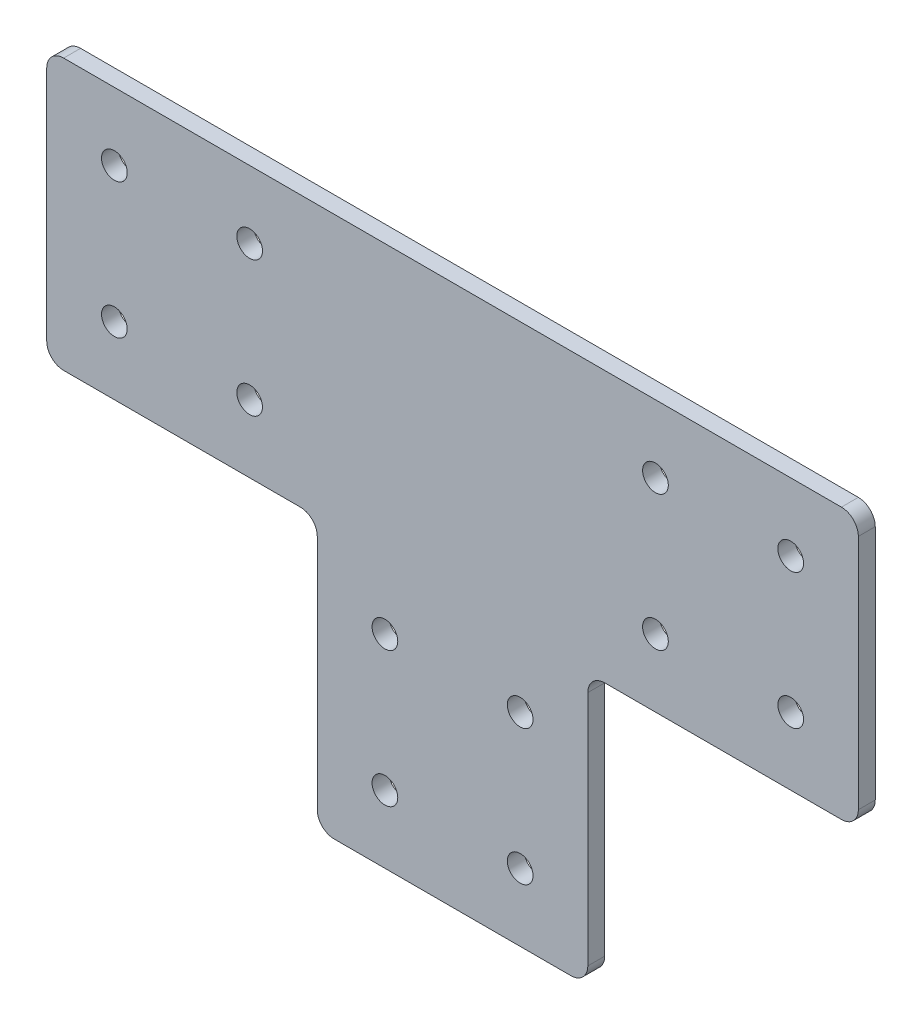
ISO-10303-21;
HEADER;
FILE_DESCRIPTION(('STEP AP214'),'2;1');
FILE_NAME('part.step','',(''),(''),'','','');
FILE_SCHEMA(('AUTOMOTIVE_DESIGN { 1 0 10303 214 1 1 1 1 }'));
ENDSEC;
DATA;
#1=APPLICATION_CONTEXT('core data for automotive mechanical design processes');
#2=APPLICATION_PROTOCOL_DEFINITION('international standard','automotive_design',2000,#1);
#3=PRODUCT_CONTEXT('',#1,'mechanical');
#4=PRODUCT('Part','Part','',(#3));
#5=PRODUCT_RELATED_PRODUCT_CATEGORY('part','',(#4));
#6=PRODUCT_DEFINITION_FORMATION('','',#4);
#7=PRODUCT_DEFINITION_CONTEXT('part definition',#1,'design');
#8=PRODUCT_DEFINITION('design','',#6,#7);
#9=PRODUCT_DEFINITION_SHAPE('','',#8);
#10=(LENGTH_UNIT() NAMED_UNIT(*) SI_UNIT(.MILLI.,.METRE.));
#11=(NAMED_UNIT(*) PLANE_ANGLE_UNIT() SI_UNIT($,.RADIAN.));
#12=(NAMED_UNIT(*) SI_UNIT($,.STERADIAN.) SOLID_ANGLE_UNIT());
#13=UNCERTAINTY_MEASURE_WITH_UNIT(LENGTH_MEASURE(1.E-05),#10,'distance_accuracy_value','');
#14=(GEOMETRIC_REPRESENTATION_CONTEXT(3) GLOBAL_UNCERTAINTY_ASSIGNED_CONTEXT((#13)) GLOBAL_UNIT_ASSIGNED_CONTEXT((#10,
#11,#12)) REPRESENTATION_CONTEXT('',''));
#15=CARTESIAN_POINT('',(0.,0.,0.));
#16=DIRECTION('',(0.,0.,1.));
#17=DIRECTION('',(1.,0.,0.));
#18=AXIS2_PLACEMENT_3D('',#15,#16,#17);
#19=CARTESIAN_POINT('',(0.,0.,3.175));
#20=DIRECTION('',(0.,0.,-1.));
#21=DIRECTION('',(-1.,0.,0.));
#22=AXIS2_PLACEMENT_3D('',#19,#20,#21);
#23=PLANE('',#22);
#24=DIRECTION('',(1.,0.,0.));
#25=VECTOR('',#24,1.);
#26=CARTESIAN_POINT('',(25.4,-101.6,3.175));
#27=LINE('',#26,#25);
#28=CARTESIAN_POINT('',(-22.225,-101.6,3.175));
#29=VERTEX_POINT('',#28);
#30=CARTESIAN_POINT('',(22.225,-101.6,3.175));
#31=VERTEX_POINT('',#30);
#32=EDGE_CURVE('E196',#29,#31,#27,.T.);
#33=ORIENTED_EDGE('',*,*,#32,.T.);
#34=CARTESIAN_POINT('',(22.225,-98.425,3.175));
#35=DIRECTION('',(0.,0.,-1.));
#36=DIRECTION('',(-1.,0.,0.));
#37=AXIS2_PLACEMENT_3D('',#34,#35,#36);
#38=CIRCLE('',#37,3.175);
#39=CARTESIAN_POINT('',(25.4,-98.425,3.175));
#40=VERTEX_POINT('',#39);
#41=EDGE_CURVE('E255',#31,#40,#38,.F.);
#42=ORIENTED_EDGE('',*,*,#41,.T.);
#43=DIRECTION('',(0.,1.,0.));
#44=VECTOR('',#43,1.);
#45=CARTESIAN_POINT('',(25.4,-50.8,3.175));
#46=LINE('',#45,#44);
#47=CARTESIAN_POINT('',(25.4,-53.975,3.175));
#48=VERTEX_POINT('',#47);
#49=EDGE_CURVE('E175',#40,#48,#46,.T.);
#50=ORIENTED_EDGE('',*,*,#49,.T.);
#51=CARTESIAN_POINT('',(28.575,-53.975,3.175));
#52=DIRECTION('',(0.,0.,-1.));
#53=DIRECTION('',(-1.,0.,0.));
#54=AXIS2_PLACEMENT_3D('',#51,#52,#53);
#55=CIRCLE('',#54,3.175);
#56=CARTESIAN_POINT('',(28.575,-50.8,3.175));
#57=VERTEX_POINT('',#56);
#58=EDGE_CURVE('E11',#48,#57,#55,.T.);
#59=ORIENTED_EDGE('',*,*,#58,.T.);
#60=DIRECTION('',(1.,0.,0.));
#61=VECTOR('',#60,1.);
#62=CARTESIAN_POINT('',(76.2,-50.8,3.175));
#63=LINE('',#62,#61);
#64=CARTESIAN_POINT('',(73.025,-50.8,3.175));
#65=VERTEX_POINT('',#64);
#66=EDGE_CURVE('E323',#57,#65,#63,.T.);
#67=ORIENTED_EDGE('',*,*,#66,.T.);
#68=CARTESIAN_POINT('',(73.025,-47.625,3.175));
#69=DIRECTION('',(0.,0.,-1.));
#70=DIRECTION('',(-1.,0.,0.));
#71=AXIS2_PLACEMENT_3D('',#68,#69,#70);
#72=CIRCLE('',#71,3.175);
#73=CARTESIAN_POINT('',(76.2,-47.625,3.175));
#74=VERTEX_POINT('',#73);
#75=EDGE_CURVE('E243',#65,#74,#72,.F.);
#76=ORIENTED_EDGE('',*,*,#75,.T.);
#77=DIRECTION('',(0.,1.,0.));
#78=VECTOR('',#77,1.);
#79=CARTESIAN_POINT('',(76.2,0.,3.175));
#80=LINE('',#79,#78);
#81=CARTESIAN_POINT('',(76.2,-3.175,3.175));
#82=VERTEX_POINT('',#81);
#83=EDGE_CURVE('E319',#74,#82,#80,.T.);
#84=ORIENTED_EDGE('',*,*,#83,.T.);
#85=CARTESIAN_POINT('',(73.025,-3.175,3.175));
#86=DIRECTION('',(0.,0.,-1.));
#87=DIRECTION('',(-1.,0.,0.));
#88=AXIS2_PLACEMENT_3D('',#85,#86,#87);
#89=CIRCLE('',#88,3.175);
#90=CARTESIAN_POINT('',(73.025,0.,3.175));
#91=VERTEX_POINT('',#90);
#92=EDGE_CURVE('E246',#82,#91,#89,.F.);
#93=ORIENTED_EDGE('',*,*,#92,.T.);
#94=DIRECTION('',(-1.,0.,0.));
#95=VECTOR('',#94,1.);
#96=CARTESIAN_POINT('',(-76.2,0.,3.175));
#97=LINE('',#96,#95);
#98=CARTESIAN_POINT('',(-73.025,0.,3.175));
#99=VERTEX_POINT('',#98);
#100=EDGE_CURVE('E315',#91,#99,#97,.T.);
#101=ORIENTED_EDGE('',*,*,#100,.T.);
#102=CARTESIAN_POINT('',(-73.025,-3.175,3.175));
#103=DIRECTION('',(0.,0.,-1.));
#104=DIRECTION('',(-1.,0.,0.));
#105=AXIS2_PLACEMENT_3D('',#102,#103,#104);
#106=CIRCLE('',#105,3.175);
#107=CARTESIAN_POINT('',(-76.2,-3.175,3.175));
#108=VERTEX_POINT('',#107);
#109=EDGE_CURVE('E240',#99,#108,#106,.F.);
#110=ORIENTED_EDGE('',*,*,#109,.T.);
#111=DIRECTION('',(0.,-1.,0.));
#112=VECTOR('',#111,1.);
#113=CARTESIAN_POINT('',(-76.2,-50.8,3.175));
#114=LINE('',#113,#112);
#115=CARTESIAN_POINT('',(-76.2,-47.625,3.175));
#116=VERTEX_POINT('',#115);
#117=EDGE_CURVE('E311',#108,#116,#114,.T.);
#118=ORIENTED_EDGE('',*,*,#117,.T.);
#119=CARTESIAN_POINT('',(-73.025,-47.625,3.175));
#120=DIRECTION('',(0.,0.,-1.));
#121=DIRECTION('',(-1.,0.,0.));
#122=AXIS2_PLACEMENT_3D('',#119,#120,#121);
#123=CIRCLE('',#122,3.175);
#124=CARTESIAN_POINT('',(-73.025,-50.8,3.175));
#125=VERTEX_POINT('',#124);
#126=EDGE_CURVE('E249',#116,#125,#123,.F.);
#127=ORIENTED_EDGE('',*,*,#126,.T.);
#128=DIRECTION('',(1.,0.,0.));
#129=VECTOR('',#128,1.);
#130=CARTESIAN_POINT('',(-25.4,-50.8,3.175));
#131=LINE('',#130,#129);
#132=CARTESIAN_POINT('',(-28.575,-50.8,3.175));
#133=VERTEX_POINT('',#132);
#134=EDGE_CURVE('E309',#125,#133,#131,.T.);
#135=ORIENTED_EDGE('',*,*,#134,.T.);
#136=CARTESIAN_POINT('',(-28.575,-53.975,3.175));
#137=DIRECTION('',(0.,0.,-1.));
#138=DIRECTION('',(-1.,0.,0.));
#139=AXIS2_PLACEMENT_3D('',#136,#137,#138);
#140=CIRCLE('',#139,3.175);
#141=CARTESIAN_POINT('',(-25.4,-53.975,3.175));
#142=VERTEX_POINT('',#141);
#143=EDGE_CURVE('E62',#133,#142,#140,.T.);
#144=ORIENTED_EDGE('',*,*,#143,.T.);
#145=DIRECTION('',(0.,-1.,0.));
#146=VECTOR('',#145,1.);
#147=CARTESIAN_POINT('',(-25.4,-101.6,3.175));
#148=LINE('',#147,#146);
#149=CARTESIAN_POINT('',(-25.4,-98.425,3.175));
#150=VERTEX_POINT('',#149);
#151=EDGE_CURVE('E307',#142,#150,#148,.T.);
#152=ORIENTED_EDGE('',*,*,#151,.T.);
#153=CARTESIAN_POINT('',(-22.225,-98.425,3.175));
#154=DIRECTION('',(0.,0.,-1.));
#155=DIRECTION('',(-1.,0.,0.));
#156=AXIS2_PLACEMENT_3D('',#153,#154,#155);
#157=CIRCLE('',#156,3.175);
#158=EDGE_CURVE('E252',#150,#29,#157,.F.);
#159=ORIENTED_EDGE('',*,*,#158,.T.);
#160=EDGE_LOOP('',(#33,#42,#50,#59,#67,#76,#84,#93,#101,#110,#118,#127,#135,#144,#152,#159));
#161=FACE_BOUND('',#160,.T.);
#162=CARTESIAN_POINT('',(-63.5,-12.7,3.175));
#163=DIRECTION('',(0.,0.,1.));
#164=DIRECTION('',(1.,0.,0.));
#165=AXIS2_PLACEMENT_3D('',#162,#163,#164);
#166=CIRCLE('',#165,2.41299999999999);
#167=CARTESIAN_POINT('',(-61.087,-12.7,3.175));
#168=VERTEX_POINT('',#167);
#169=EDGE_CURVE('E185',#168,#168,#166,.T.);
#170=ORIENTED_EDGE('',*,*,#169,.F.);
#171=EDGE_LOOP('',(#170));
#172=FACE_BOUND('',#171,.T.);
#173=CARTESIAN_POINT('',(-63.5,-38.1,3.175));
#174=DIRECTION('',(0.,0.,1.));
#175=DIRECTION('',(1.,0.,0.));
#176=AXIS2_PLACEMENT_3D('',#173,#174,#175);
#177=CIRCLE('',#176,2.41299999999999);
#178=CARTESIAN_POINT('',(-61.087,-38.1,3.175));
#179=VERTEX_POINT('',#178);
#180=EDGE_CURVE('E333',#179,#179,#177,.T.);
#181=ORIENTED_EDGE('',*,*,#180,.F.);
#182=EDGE_LOOP('',(#181));
#183=FACE_BOUND('',#182,.T.);
#184=CARTESIAN_POINT('',(-38.1,-12.7,3.175));
#185=DIRECTION('',(0.,0.,1.));
#186=DIRECTION('',(1.,0.,0.));
#187=AXIS2_PLACEMENT_3D('',#184,#185,#186);
#188=CIRCLE('',#187,2.413);
#189=CARTESIAN_POINT('',(-35.687,-12.7,3.175));
#190=VERTEX_POINT('',#189);
#191=EDGE_CURVE('E339',#190,#190,#188,.T.);
#192=ORIENTED_EDGE('',*,*,#191,.F.);
#193=EDGE_LOOP('',(#192));
#194=FACE_BOUND('',#193,.T.);
#195=CARTESIAN_POINT('',(-38.1,-38.1,3.175));
#196=DIRECTION('',(0.,0.,1.));
#197=DIRECTION('',(1.,0.,0.));
#198=AXIS2_PLACEMENT_3D('',#195,#196,#197);
#199=CIRCLE('',#198,2.413);
#200=CARTESIAN_POINT('',(-35.687,-38.1,3.175));
#201=VERTEX_POINT('',#200);
#202=EDGE_CURVE('E347',#201,#201,#199,.T.);
#203=ORIENTED_EDGE('',*,*,#202,.F.);
#204=EDGE_LOOP('',(#203));
#205=FACE_BOUND('',#204,.T.);
#206=CARTESIAN_POINT('',(-12.7,-88.9,3.175));
#207=DIRECTION('',(0.,0.,1.));
#208=DIRECTION('',(1.,0.,0.));
#209=AXIS2_PLACEMENT_3D('',#206,#207,#208);
#210=CIRCLE('',#209,2.413);
#211=CARTESIAN_POINT('',(-10.287,-88.9,3.175));
#212=VERTEX_POINT('',#211);
#213=EDGE_CURVE('E355',#212,#212,#210,.T.);
#214=ORIENTED_EDGE('',*,*,#213,.F.);
#215=EDGE_LOOP('',(#214));
#216=FACE_BOUND('',#215,.T.);
#217=CARTESIAN_POINT('',(-12.7,-63.5,3.175));
#218=DIRECTION('',(0.,0.,1.));
#219=DIRECTION('',(1.,0.,0.));
#220=AXIS2_PLACEMENT_3D('',#217,#218,#219);
#221=CIRCLE('',#220,2.413);
#222=CARTESIAN_POINT('',(-10.287,-63.5,3.175));
#223=VERTEX_POINT('',#222);
#224=EDGE_CURVE('E363',#223,#223,#221,.T.);
#225=ORIENTED_EDGE('',*,*,#224,.F.);
#226=EDGE_LOOP('',(#225));
#227=FACE_BOUND('',#226,.T.);
#228=CARTESIAN_POINT('',(12.7,-88.9,3.175));
#229=DIRECTION('',(0.,0.,1.));
#230=DIRECTION('',(-1.,0.,0.));
#231=AXIS2_PLACEMENT_3D('',#228,#229,#230);
#232=CIRCLE('',#231,2.413);
#233=CARTESIAN_POINT('',(10.287,-88.9,3.175));
#234=VERTEX_POINT('',#233);
#235=EDGE_CURVE('E371',#234,#234,#232,.T.);
#236=ORIENTED_EDGE('',*,*,#235,.F.);
#237=EDGE_LOOP('',(#236));
#238=FACE_BOUND('',#237,.T.);
#239=CARTESIAN_POINT('',(12.7,-63.5,3.175));
#240=DIRECTION('',(0.,0.,1.));
#241=DIRECTION('',(-1.,0.,0.));
#242=AXIS2_PLACEMENT_3D('',#239,#240,#241);
#243=CIRCLE('',#242,2.413);
#244=CARTESIAN_POINT('',(10.287,-63.5,3.175));
#245=VERTEX_POINT('',#244);
#246=EDGE_CURVE('E379',#245,#245,#243,.T.);
#247=ORIENTED_EDGE('',*,*,#246,.F.);
#248=EDGE_LOOP('',(#247));
#249=FACE_BOUND('',#248,.T.);
#250=CARTESIAN_POINT('',(63.5,-38.1,3.175));
#251=DIRECTION('',(0.,0.,1.));
#252=DIRECTION('',(-1.,0.,0.));
#253=AXIS2_PLACEMENT_3D('',#250,#251,#252);
#254=CIRCLE('',#253,2.41299999999999);
#255=CARTESIAN_POINT('',(61.087,-38.1,3.175));
#256=VERTEX_POINT('',#255);
#257=EDGE_CURVE('E387',#256,#256,#254,.T.);
#258=ORIENTED_EDGE('',*,*,#257,.F.);
#259=EDGE_LOOP('',(#258));
#260=FACE_BOUND('',#259,.T.);
#261=CARTESIAN_POINT('',(38.1,-38.1,3.175));
#262=DIRECTION('',(0.,0.,1.));
#263=DIRECTION('',(-1.,0.,0.));
#264=AXIS2_PLACEMENT_3D('',#261,#262,#263);
#265=CIRCLE('',#264,2.413);
#266=CARTESIAN_POINT('',(35.687,-38.1,3.175));
#267=VERTEX_POINT('',#266);
#268=EDGE_CURVE('E395',#267,#267,#265,.T.);
#269=ORIENTED_EDGE('',*,*,#268,.F.);
#270=EDGE_LOOP('',(#269));
#271=FACE_BOUND('',#270,.T.);
#272=CARTESIAN_POINT('',(38.1,-12.7,3.175));
#273=DIRECTION('',(0.,0.,1.));
#274=DIRECTION('',(-1.,0.,0.));
#275=AXIS2_PLACEMENT_3D('',#272,#273,#274);
#276=CIRCLE('',#275,2.413);
#277=CARTESIAN_POINT('',(35.687,-12.7,3.175));
#278=VERTEX_POINT('',#277);
#279=EDGE_CURVE('E403',#278,#278,#276,.T.);
#280=ORIENTED_EDGE('',*,*,#279,.F.);
#281=EDGE_LOOP('',(#280));
#282=FACE_BOUND('',#281,.T.);
#283=CARTESIAN_POINT('',(63.5,-12.7,3.175));
#284=DIRECTION('',(0.,0.,1.));
#285=DIRECTION('',(-1.,0.,0.));
#286=AXIS2_PLACEMENT_3D('',#283,#284,#285);
#287=CIRCLE('',#286,2.41299999999999);
#288=CARTESIAN_POINT('',(61.087,-12.7,3.175));
#289=VERTEX_POINT('',#288);
#290=EDGE_CURVE('E411',#289,#289,#287,.T.);
#291=ORIENTED_EDGE('',*,*,#290,.F.);
#292=EDGE_LOOP('',(#291));
#293=FACE_BOUND('',#292,.T.);
#294=ADVANCED_FACE('F39',(#161,#172,#183,#194,#205,#216,#227,#238,#249,#260,#271,#282,#293),#23,.F.);
#295=CARTESIAN_POINT('',(0.,0.,0.));
#296=DIRECTION('',(0.,0.,-1.));
#297=DIRECTION('',(-1.,0.,0.));
#298=AXIS2_PLACEMENT_3D('',#295,#296,#297);
#299=PLANE('',#298);
#300=CARTESIAN_POINT('',(38.1,-12.7,0.));
#301=DIRECTION('',(0.,0.,1.));
#302=DIRECTION('',(-1.,0.,0.));
#303=AXIS2_PLACEMENT_3D('',#300,#301,#302);
#304=CIRCLE('',#303,2.413);
#305=CARTESIAN_POINT('',(35.687,-12.7,0.));
#306=VERTEX_POINT('',#305);
#307=EDGE_CURVE('E407',#306,#306,#304,.T.);
#308=ORIENTED_EDGE('',*,*,#307,.T.);
#309=EDGE_LOOP('',(#308));
#310=FACE_BOUND('',#309,.T.);
#311=CARTESIAN_POINT('',(63.5,-38.1,0.));
#312=DIRECTION('',(0.,0.,1.));
#313=DIRECTION('',(-1.,0.,0.));
#314=AXIS2_PLACEMENT_3D('',#311,#312,#313);
#315=CIRCLE('',#314,2.41299999999999);
#316=CARTESIAN_POINT('',(61.087,-38.1,0.));
#317=VERTEX_POINT('',#316);
#318=EDGE_CURVE('E391',#317,#317,#315,.T.);
#319=ORIENTED_EDGE('',*,*,#318,.T.);
#320=EDGE_LOOP('',(#319));
#321=FACE_BOUND('',#320,.T.);
#322=CARTESIAN_POINT('',(12.7,-88.9,0.));
#323=DIRECTION('',(0.,0.,1.));
#324=DIRECTION('',(-1.,0.,0.));
#325=AXIS2_PLACEMENT_3D('',#322,#323,#324);
#326=CIRCLE('',#325,2.413);
#327=CARTESIAN_POINT('',(10.287,-88.9,0.));
#328=VERTEX_POINT('',#327);
#329=EDGE_CURVE('E375',#328,#328,#326,.T.);
#330=ORIENTED_EDGE('',*,*,#329,.T.);
#331=EDGE_LOOP('',(#330));
#332=FACE_BOUND('',#331,.T.);
#333=CARTESIAN_POINT('',(-12.7,-88.9,0.));
#334=DIRECTION('',(0.,0.,1.));
#335=DIRECTION('',(1.,0.,0.));
#336=AXIS2_PLACEMENT_3D('',#333,#334,#335);
#337=CIRCLE('',#336,2.413);
#338=CARTESIAN_POINT('',(-10.287,-88.9,0.));
#339=VERTEX_POINT('',#338);
#340=EDGE_CURVE('E359',#339,#339,#337,.T.);
#341=ORIENTED_EDGE('',*,*,#340,.T.);
#342=EDGE_LOOP('',(#341));
#343=FACE_BOUND('',#342,.T.);
#344=CARTESIAN_POINT('',(-38.1,-12.7,0.));
#345=DIRECTION('',(0.,0.,1.));
#346=DIRECTION('',(1.,0.,0.));
#347=AXIS2_PLACEMENT_3D('',#344,#345,#346);
#348=CIRCLE('',#347,2.413);
#349=CARTESIAN_POINT('',(-35.687,-12.7,0.));
#350=VERTEX_POINT('',#349);
#351=EDGE_CURVE('E343',#350,#350,#348,.T.);
#352=ORIENTED_EDGE('',*,*,#351,.T.);
#353=EDGE_LOOP('',(#352));
#354=FACE_BOUND('',#353,.T.);
#355=CARTESIAN_POINT('',(-63.5,-12.7,0.));
#356=DIRECTION('',(0.,0.,1.));
#357=DIRECTION('',(1.,0.,0.));
#358=AXIS2_PLACEMENT_3D('',#355,#356,#357);
#359=CIRCLE('',#358,2.41299999999999);
#360=CARTESIAN_POINT('',(-61.087,-12.7,0.));
#361=VERTEX_POINT('',#360);
#362=EDGE_CURVE('E193',#361,#361,#359,.T.);
#363=ORIENTED_EDGE('',*,*,#362,.T.);
#364=EDGE_LOOP('',(#363));
#365=FACE_BOUND('',#364,.T.);
#366=DIRECTION('',(0.,1.,0.));
#367=VECTOR('',#366,1.);
#368=CARTESIAN_POINT('',(25.4,-50.8,0.));
#369=LINE('',#368,#367);
#370=CARTESIAN_POINT('',(25.4,-98.425,0.));
#371=VERTEX_POINT('',#370);
#372=CARTESIAN_POINT('',(25.4,-53.975,0.));
#373=VERTEX_POINT('',#372);
#374=EDGE_CURVE('E172',#371,#373,#369,.T.);
#375=ORIENTED_EDGE('',*,*,#374,.F.);
#376=CARTESIAN_POINT('',(22.225,-98.425,0.));
#377=DIRECTION('',(0.,0.,-1.));
#378=DIRECTION('',(-1.,0.,0.));
#379=AXIS2_PLACEMENT_3D('',#376,#377,#378);
#380=CIRCLE('',#379,3.175);
#381=CARTESIAN_POINT('',(22.225,-101.6,0.));
#382=VERTEX_POINT('',#381);
#383=EDGE_CURVE('E154',#371,#382,#380,.T.);
#384=ORIENTED_EDGE('',*,*,#383,.T.);
#385=DIRECTION('',(1.,0.,0.));
#386=VECTOR('',#385,1.);
#387=CARTESIAN_POINT('',(25.4,-101.6,0.));
#388=LINE('',#387,#386);
#389=CARTESIAN_POINT('',(-22.225,-101.6,0.));
#390=VERTEX_POINT('',#389);
#391=EDGE_CURVE('E217',#390,#382,#388,.T.);
#392=ORIENTED_EDGE('',*,*,#391,.F.);
#393=CARTESIAN_POINT('',(-22.225,-98.425,0.));
#394=DIRECTION('',(0.,0.,-1.));
#395=DIRECTION('',(-1.,0.,0.));
#396=AXIS2_PLACEMENT_3D('',#393,#394,#395);
#397=CIRCLE('',#396,3.175);
#398=CARTESIAN_POINT('',(-25.4,-98.425,0.));
#399=VERTEX_POINT('',#398);
#400=EDGE_CURVE('E166',#390,#399,#397,.T.);
#401=ORIENTED_EDGE('',*,*,#400,.T.);
#402=DIRECTION('',(0.,-1.,0.));
#403=VECTOR('',#402,1.);
#404=CARTESIAN_POINT('',(-25.4,-101.6,0.));
#405=LINE('',#404,#403);
#406=CARTESIAN_POINT('',(-25.4,-53.975,0.));
#407=VERTEX_POINT('',#406);
#408=EDGE_CURVE('E214',#407,#399,#405,.T.);
#409=ORIENTED_EDGE('',*,*,#408,.F.);
#410=CARTESIAN_POINT('',(-28.575,-53.975,0.));
#411=DIRECTION('',(0.,0.,-1.));
#412=DIRECTION('',(-1.,0.,0.));
#413=AXIS2_PLACEMENT_3D('',#410,#411,#412);
#414=CIRCLE('',#413,3.175);
#415=CARTESIAN_POINT('',(-28.575,-50.8,0.));
#416=VERTEX_POINT('',#415);
#417=EDGE_CURVE('E299',#407,#416,#414,.F.);
#418=ORIENTED_EDGE('',*,*,#417,.T.);
#419=DIRECTION('',(1.,0.,0.));
#420=VECTOR('',#419,1.);
#421=CARTESIAN_POINT('',(-25.4,-50.8,0.));
#422=LINE('',#421,#420);
#423=CARTESIAN_POINT('',(-73.025,-50.8,0.));
#424=VERTEX_POINT('',#423);
#425=EDGE_CURVE('E210',#424,#416,#422,.T.);
#426=ORIENTED_EDGE('',*,*,#425,.F.);
#427=CARTESIAN_POINT('',(-73.025,-47.625,0.));
#428=DIRECTION('',(0.,0.,-1.));
#429=DIRECTION('',(-1.,0.,0.));
#430=AXIS2_PLACEMENT_3D('',#427,#428,#429);
#431=CIRCLE('',#430,3.175);
#432=CARTESIAN_POINT('',(-76.2,-47.625,0.));
#433=VERTEX_POINT('',#432);
#434=EDGE_CURVE('E230',#424,#433,#431,.T.);
#435=ORIENTED_EDGE('',*,*,#434,.T.);
#436=DIRECTION('',(0.,-1.,0.));
#437=VECTOR('',#436,1.);
#438=CARTESIAN_POINT('',(-76.2,-50.8,0.));
#439=LINE('',#438,#437);
#440=CARTESIAN_POINT('',(-76.2,-3.175,0.));
#441=VERTEX_POINT('',#440);
#442=EDGE_CURVE('E206',#441,#433,#439,.T.);
#443=ORIENTED_EDGE('',*,*,#442,.F.);
#444=CARTESIAN_POINT('',(-73.025,-3.175,0.));
#445=DIRECTION('',(0.,0.,-1.));
#446=DIRECTION('',(-1.,0.,0.));
#447=AXIS2_PLACEMENT_3D('',#444,#445,#446);
#448=CIRCLE('',#447,3.175);
#449=CARTESIAN_POINT('',(-73.025,0.,0.));
#450=VERTEX_POINT('',#449);
#451=EDGE_CURVE('E177',#441,#450,#448,.T.);
#452=ORIENTED_EDGE('',*,*,#451,.T.);
#453=DIRECTION('',(-1.,0.,0.));
#454=VECTOR('',#453,1.);
#455=CARTESIAN_POINT('',(-76.2,0.,0.));
#456=LINE('',#455,#454);
#457=CARTESIAN_POINT('',(73.025,0.,0.));
#458=VERTEX_POINT('',#457);
#459=EDGE_CURVE('E202',#458,#450,#456,.T.);
#460=ORIENTED_EDGE('',*,*,#459,.F.);
#461=CARTESIAN_POINT('',(73.025,-3.175,0.));
#462=DIRECTION('',(0.,0.,-1.));
#463=DIRECTION('',(-1.,0.,0.));
#464=AXIS2_PLACEMENT_3D('',#461,#462,#463);
#465=CIRCLE('',#464,3.175);
#466=CARTESIAN_POINT('',(76.2,-3.175,0.));
#467=VERTEX_POINT('',#466);
#468=EDGE_CURVE('E227',#458,#467,#465,.T.);
#469=ORIENTED_EDGE('',*,*,#468,.T.);
#470=DIRECTION('',(0.,1.,0.));
#471=VECTOR('',#470,1.);
#472=CARTESIAN_POINT('',(76.2,0.,0.));
#473=LINE('',#472,#471);
#474=CARTESIAN_POINT('',(76.2,-47.625,0.));
#475=VERTEX_POINT('',#474);
#476=EDGE_CURVE('E190',#475,#467,#473,.T.);
#477=ORIENTED_EDGE('',*,*,#476,.F.);
#478=CARTESIAN_POINT('',(73.025,-47.625,0.));
#479=DIRECTION('',(0.,0.,-1.));
#480=DIRECTION('',(-1.,0.,0.));
#481=AXIS2_PLACEMENT_3D('',#478,#479,#480);
#482=CIRCLE('',#481,3.175);
#483=CARTESIAN_POINT('',(73.025,-50.8,0.));
#484=VERTEX_POINT('',#483);
#485=EDGE_CURVE('E224',#475,#484,#482,.T.);
#486=ORIENTED_EDGE('',*,*,#485,.T.);
#487=DIRECTION('',(1.,0.,0.));
#488=VECTOR('',#487,1.);
#489=CARTESIAN_POINT('',(76.2,-50.8,0.));
#490=LINE('',#489,#488);
#491=CARTESIAN_POINT('',(28.575,-50.8,0.));
#492=VERTEX_POINT('',#491);
#493=EDGE_CURVE('E184',#492,#484,#490,.T.);
#494=ORIENTED_EDGE('',*,*,#493,.F.);
#495=CARTESIAN_POINT('',(28.575,-53.975,0.));
#496=DIRECTION('',(0.,0.,-1.));
#497=DIRECTION('',(-1.,0.,0.));
#498=AXIS2_PLACEMENT_3D('',#495,#496,#497);
#499=CIRCLE('',#498,3.175);
#500=EDGE_CURVE('E48',#492,#373,#499,.F.);
#501=ORIENTED_EDGE('',*,*,#500,.T.);
#502=EDGE_LOOP('',(#375,#384,#392,#401,#409,#418,#426,#435,#443,#452,#460,#469,#477,#486,#494,#501));
#503=FACE_BOUND('',#502,.T.);
#504=CARTESIAN_POINT('',(-63.5,-38.1,0.));
#505=DIRECTION('',(0.,0.,1.));
#506=DIRECTION('',(1.,0.,0.));
#507=AXIS2_PLACEMENT_3D('',#504,#505,#506);
#508=CIRCLE('',#507,2.41299999999999);
#509=CARTESIAN_POINT('',(-61.087,-38.1,0.));
#510=VERTEX_POINT('',#509);
#511=EDGE_CURVE('E335',#510,#510,#508,.T.);
#512=ORIENTED_EDGE('',*,*,#511,.T.);
#513=EDGE_LOOP('',(#512));
#514=FACE_BOUND('',#513,.T.);
#515=CARTESIAN_POINT('',(-38.1,-38.1,0.));
#516=DIRECTION('',(0.,0.,1.));
#517=DIRECTION('',(1.,0.,0.));
#518=AXIS2_PLACEMENT_3D('',#515,#516,#517);
#519=CIRCLE('',#518,2.413);
#520=CARTESIAN_POINT('',(-35.687,-38.1,0.));
#521=VERTEX_POINT('',#520);
#522=EDGE_CURVE('E351',#521,#521,#519,.T.);
#523=ORIENTED_EDGE('',*,*,#522,.T.);
#524=EDGE_LOOP('',(#523));
#525=FACE_BOUND('',#524,.T.);
#526=CARTESIAN_POINT('',(-12.7,-63.5,0.));
#527=DIRECTION('',(0.,0.,1.));
#528=DIRECTION('',(1.,0.,0.));
#529=AXIS2_PLACEMENT_3D('',#526,#527,#528);
#530=CIRCLE('',#529,2.413);
#531=CARTESIAN_POINT('',(-10.287,-63.5,0.));
#532=VERTEX_POINT('',#531);
#533=EDGE_CURVE('E367',#532,#532,#530,.T.);
#534=ORIENTED_EDGE('',*,*,#533,.T.);
#535=EDGE_LOOP('',(#534));
#536=FACE_BOUND('',#535,.T.);
#537=CARTESIAN_POINT('',(12.7,-63.5,0.));
#538=DIRECTION('',(0.,0.,1.));
#539=DIRECTION('',(-1.,0.,0.));
#540=AXIS2_PLACEMENT_3D('',#537,#538,#539);
#541=CIRCLE('',#540,2.413);
#542=CARTESIAN_POINT('',(10.287,-63.5,0.));
#543=VERTEX_POINT('',#542);
#544=EDGE_CURVE('E383',#543,#543,#541,.T.);
#545=ORIENTED_EDGE('',*,*,#544,.T.);
#546=EDGE_LOOP('',(#545));
#547=FACE_BOUND('',#546,.T.);
#548=CARTESIAN_POINT('',(38.1,-38.1,0.));
#549=DIRECTION('',(0.,0.,1.));
#550=DIRECTION('',(-1.,0.,0.));
#551=AXIS2_PLACEMENT_3D('',#548,#549,#550);
#552=CIRCLE('',#551,2.413);
#553=CARTESIAN_POINT('',(35.687,-38.1,0.));
#554=VERTEX_POINT('',#553);
#555=EDGE_CURVE('E399',#554,#554,#552,.T.);
#556=ORIENTED_EDGE('',*,*,#555,.T.);
#557=EDGE_LOOP('',(#556));
#558=FACE_BOUND('',#557,.T.);
#559=CARTESIAN_POINT('',(63.5,-12.7,0.));
#560=DIRECTION('',(0.,0.,1.));
#561=DIRECTION('',(-1.,0.,0.));
#562=AXIS2_PLACEMENT_3D('',#559,#560,#561);
#563=CIRCLE('',#562,2.41299999999999);
#564=CARTESIAN_POINT('',(61.087,-12.7,0.));
#565=VERTEX_POINT('',#564);
#566=EDGE_CURVE('E415',#565,#565,#563,.T.);
#567=ORIENTED_EDGE('',*,*,#566,.T.);
#568=EDGE_LOOP('',(#567));
#569=FACE_BOUND('',#568,.T.);
#570=ADVANCED_FACE('F180',(#310,#321,#332,#343,#354,#365,#503,#514,#525,#536,#547,#558,#569),
#299,.T.);
#571=CARTESIAN_POINT('',(25.4,-50.8,3.175));
#572=DIRECTION('',(-1.,0.,0.));
#573=DIRECTION('',(0.,0.,1.));
#574=AXIS2_PLACEMENT_3D('',#571,#572,#573);
#575=PLANE('',#574);
#576=ORIENTED_EDGE('',*,*,#49,.F.);
#577=DIRECTION('',(0.,0.,-1.));
#578=VECTOR('',#577,1.);
#579=CARTESIAN_POINT('',(25.4,-98.425,3.175));
#580=LINE('',#579,#578);
#581=EDGE_CURVE('E158',#40,#371,#580,.T.);
#582=ORIENTED_EDGE('',*,*,#581,.T.);
#583=ORIENTED_EDGE('',*,*,#374,.T.);
#584=DIRECTION('',(0.,0.,-1.));
#585=VECTOR('',#584,1.);
#586=CARTESIAN_POINT('',(25.4,-53.975,3.175));
#587=LINE('',#586,#585);
#588=EDGE_CURVE('E178',#373,#48,#587,.F.);
#589=ORIENTED_EDGE('',*,*,#588,.T.);
#590=EDGE_LOOP('',(#576,#582,#583,#589));
#591=FACE_BOUND('',#590,.T.);
#592=ADVANCED_FACE('F171',(#591),#575,.F.);
#593=CARTESIAN_POINT('',(76.2,-50.8,3.175));
#594=DIRECTION('',(0.,1.,0.));
#595=DIRECTION('',(-1.,0.,0.));
#596=AXIS2_PLACEMENT_3D('',#593,#594,#595);
#597=PLANE('',#596);
#598=ORIENTED_EDGE('',*,*,#493,.T.);
#599=DIRECTION('',(0.,0.,-1.));
#600=VECTOR('',#599,1.);
#601=CARTESIAN_POINT('',(73.025,-50.8,3.175));
#602=LINE('',#601,#600);
#603=EDGE_CURVE('E296',#484,#65,#602,.F.);
#604=ORIENTED_EDGE('',*,*,#603,.T.);
#605=ORIENTED_EDGE('',*,*,#66,.F.);
#606=DIRECTION('',(0.,0.,-1.));
#607=VECTOR('',#606,1.);
#608=CARTESIAN_POINT('',(28.575,-50.8,0.));
#609=LINE('',#608,#607);
#610=EDGE_CURVE('E292',#57,#492,#609,.T.);
#611=ORIENTED_EDGE('',*,*,#610,.T.);
#612=EDGE_LOOP('',(#598,#604,#605,#611));
#613=FACE_BOUND('',#612,.T.);
#614=ADVANCED_FACE('F460',(#613),#597,.F.);
#615=CARTESIAN_POINT('',(76.2,0.,3.175));
#616=DIRECTION('',(-1.,0.,0.));
#617=DIRECTION('',(0.,0.,1.));
#618=AXIS2_PLACEMENT_3D('',#615,#616,#617);
#619=PLANE('',#618);
#620=ORIENTED_EDGE('',*,*,#476,.T.);
#621=DIRECTION('',(0.,0.,-1.));
#622=VECTOR('',#621,1.);
#623=CARTESIAN_POINT('',(76.2,-3.175,3.175));
#624=LINE('',#623,#622);
#625=EDGE_CURVE('E289',#467,#82,#624,.F.);
#626=ORIENTED_EDGE('',*,*,#625,.T.);
#627=ORIENTED_EDGE('',*,*,#83,.F.);
#628=DIRECTION('',(0.,0.,-1.));
#629=VECTOR('',#628,1.);
#630=CARTESIAN_POINT('',(76.2,-47.625,3.175));
#631=LINE('',#630,#629);
#632=EDGE_CURVE('E285',#74,#475,#631,.T.);
#633=ORIENTED_EDGE('',*,*,#632,.T.);
#634=EDGE_LOOP('',(#620,#626,#627,#633));
#635=FACE_BOUND('',#634,.T.);
#636=ADVANCED_FACE('F456',(#635),#619,.F.);
#637=CARTESIAN_POINT('',(-76.2,0.,3.175));
#638=DIRECTION('',(0.,-1.,0.));
#639=DIRECTION('',(0.,0.,-1.));
#640=AXIS2_PLACEMENT_3D('',#637,#638,#639);
#641=PLANE('',#640);
#642=ORIENTED_EDGE('',*,*,#100,.F.);
#643=DIRECTION('',(0.,0.,-1.));
#644=VECTOR('',#643,1.);
#645=CARTESIAN_POINT('',(73.025,0.,3.175));
#646=LINE('',#645,#644);
#647=EDGE_CURVE('E281',#91,#458,#646,.T.);
#648=ORIENTED_EDGE('',*,*,#647,.T.);
#649=ORIENTED_EDGE('',*,*,#459,.T.);
#650=DIRECTION('',(0.,0.,-1.));
#651=VECTOR('',#650,1.);
#652=CARTESIAN_POINT('',(-73.025,0.,3.175));
#653=LINE('',#652,#651);
#654=EDGE_CURVE('E278',#450,#99,#653,.F.);
#655=ORIENTED_EDGE('',*,*,#654,.T.);
#656=EDGE_LOOP('',(#642,#648,#649,#655));
#657=FACE_BOUND('',#656,.T.);
#658=ADVANCED_FACE('F452',(#657),#641,.F.);
#659=CARTESIAN_POINT('',(-76.2,-50.8,3.175));
#660=DIRECTION('',(1.,0.,0.));
#661=DIRECTION('',(0.,0.,-1.));
#662=AXIS2_PLACEMENT_3D('',#659,#660,#661);
#663=PLANE('',#662);
#664=ORIENTED_EDGE('',*,*,#442,.T.);
#665=DIRECTION('',(0.,0.,-1.));
#666=VECTOR('',#665,1.);
#667=CARTESIAN_POINT('',(-76.2,-47.625,3.175));
#668=LINE('',#667,#666);
#669=EDGE_CURVE('E275',#433,#116,#668,.F.);
#670=ORIENTED_EDGE('',*,*,#669,.T.);
#671=ORIENTED_EDGE('',*,*,#117,.F.);
#672=DIRECTION('',(0.,0.,-1.));
#673=VECTOR('',#672,1.);
#674=CARTESIAN_POINT('',(-76.2,-3.175,3.175));
#675=LINE('',#674,#673);
#676=EDGE_CURVE('E271',#108,#441,#675,.T.);
#677=ORIENTED_EDGE('',*,*,#676,.T.);
#678=EDGE_LOOP('',(#664,#670,#671,#677));
#679=FACE_BOUND('',#678,.T.);
#680=ADVANCED_FACE('F448',(#679),#663,.F.);
#681=CARTESIAN_POINT('',(-25.4,-50.8,3.175));
#682=DIRECTION('',(0.,1.,0.));
#683=DIRECTION('',(-1.,0.,0.));
#684=AXIS2_PLACEMENT_3D('',#681,#682,#683);
#685=PLANE('',#684);
#686=ORIENTED_EDGE('',*,*,#425,.T.);
#687=DIRECTION('',(0.,0.,-1.));
#688=VECTOR('',#687,1.);
#689=CARTESIAN_POINT('',(-28.575,-50.8,3.175));
#690=LINE('',#689,#688);
#691=EDGE_CURVE('E268',#416,#133,#690,.F.);
#692=ORIENTED_EDGE('',*,*,#691,.T.);
#693=ORIENTED_EDGE('',*,*,#134,.F.);
#694=DIRECTION('',(0.,0.,-1.));
#695=VECTOR('',#694,1.);
#696=CARTESIAN_POINT('',(-73.025,-50.8,3.175));
#697=LINE('',#696,#695);
#698=EDGE_CURVE('E264',#125,#424,#697,.T.);
#699=ORIENTED_EDGE('',*,*,#698,.T.);
#700=EDGE_LOOP('',(#686,#692,#693,#699));
#701=FACE_BOUND('',#700,.T.);
#702=ADVANCED_FACE('F445',(#701),#685,.F.);
#703=CARTESIAN_POINT('',(-25.4,-101.6,3.175));
#704=DIRECTION('',(1.,0.,0.));
#705=DIRECTION('',(0.,1.,0.));
#706=AXIS2_PLACEMENT_3D('',#703,#704,#705);
#707=PLANE('',#706);
#708=ORIENTED_EDGE('',*,*,#408,.T.);
#709=DIRECTION('',(0.,0.,-1.));
#710=VECTOR('',#709,1.);
#711=CARTESIAN_POINT('',(-25.4,-98.425,3.175));
#712=LINE('',#711,#710);
#713=EDGE_CURVE('E55',#399,#150,#712,.F.);
#714=ORIENTED_EDGE('',*,*,#713,.T.);
#715=ORIENTED_EDGE('',*,*,#151,.F.);
#716=DIRECTION('',(0.,0.,-1.));
#717=VECTOR('',#716,1.);
#718=CARTESIAN_POINT('',(-25.4,-53.975,0.));
#719=LINE('',#718,#717);
#720=EDGE_CURVE('E258',#142,#407,#719,.T.);
#721=ORIENTED_EDGE('',*,*,#720,.T.);
#722=EDGE_LOOP('',(#708,#714,#715,#721));
#723=FACE_BOUND('',#722,.T.);
#724=ADVANCED_FACE('F441',(#723),#707,.F.);
#725=CARTESIAN_POINT('',(25.4,-101.6,3.175));
#726=DIRECTION('',(0.,1.,0.));
#727=DIRECTION('',(0.,0.,1.));
#728=AXIS2_PLACEMENT_3D('',#725,#726,#727);
#729=PLANE('',#728);
#730=ORIENTED_EDGE('',*,*,#391,.T.);
#731=DIRECTION('',(0.,0.,-1.));
#732=VECTOR('',#731,1.);
#733=CARTESIAN_POINT('',(22.225,-101.6,3.175));
#734=LINE('',#733,#732);
#735=EDGE_CURVE('E159',#382,#31,#734,.F.);
#736=ORIENTED_EDGE('',*,*,#735,.T.);
#737=ORIENTED_EDGE('',*,*,#32,.F.);
#738=DIRECTION('',(0.,0.,-1.));
#739=VECTOR('',#738,1.);
#740=CARTESIAN_POINT('',(-22.225,-101.6,3.175));
#741=LINE('',#740,#739);
#742=EDGE_CURVE('E165',#29,#390,#741,.T.);
#743=ORIENTED_EDGE('',*,*,#742,.T.);
#744=EDGE_LOOP('',(#730,#736,#737,#743));
#745=FACE_BOUND('',#744,.T.);
#746=ADVANCED_FACE('F438',(#745),#729,.F.);
#747=CARTESIAN_POINT('',(-63.5,-12.7,3.175));
#748=DIRECTION('',(0.,0.,-1.));
#749=DIRECTION('',(-1.,0.,0.));
#750=AXIS2_PLACEMENT_3D('',#747,#748,#749);
#751=CYLINDRICAL_SURFACE('',#750,2.41299999999999);
#752=ORIENTED_EDGE('',*,*,#169,.T.);
#753=EDGE_LOOP('',(#752));
#754=FACE_BOUND('',#753,.T.);
#755=ORIENTED_EDGE('',*,*,#362,.F.);
#756=EDGE_LOOP('',(#755));
#757=FACE_BOUND('',#756,.T.);
#758=ADVANCED_FACE('F435',(#754,#757),#751,.F.);
#759=CARTESIAN_POINT('',(-63.5,-38.1,3.175));
#760=DIRECTION('',(0.,0.,-1.));
#761=DIRECTION('',(-1.,0.,0.));
#762=AXIS2_PLACEMENT_3D('',#759,#760,#761);
#763=CYLINDRICAL_SURFACE('',#762,2.41299999999999);
#764=ORIENTED_EDGE('',*,*,#180,.T.);
#765=EDGE_LOOP('',(#764));
#766=FACE_BOUND('',#765,.T.);
#767=ORIENTED_EDGE('',*,*,#511,.F.);
#768=EDGE_LOOP('',(#767));
#769=FACE_BOUND('',#768,.T.);
#770=ADVANCED_FACE('F723',(#766,#769),#763,.F.);
#771=CARTESIAN_POINT('',(-38.1,-12.7,3.175));
#772=DIRECTION('',(0.,0.,-1.));
#773=DIRECTION('',(-1.,0.,0.));
#774=AXIS2_PLACEMENT_3D('',#771,#772,#773);
#775=CYLINDRICAL_SURFACE('',#774,2.413);
#776=ORIENTED_EDGE('',*,*,#191,.T.);
#777=EDGE_LOOP('',(#776));
#778=FACE_BOUND('',#777,.T.);
#779=ORIENTED_EDGE('',*,*,#351,.F.);
#780=EDGE_LOOP('',(#779));
#781=FACE_BOUND('',#780,.T.);
#782=ADVANCED_FACE('F713',(#778,#781),#775,.F.);
#783=CARTESIAN_POINT('',(-38.1,-38.1,3.175));
#784=DIRECTION('',(0.,0.,-1.));
#785=DIRECTION('',(-1.,0.,0.));
#786=AXIS2_PLACEMENT_3D('',#783,#784,#785);
#787=CYLINDRICAL_SURFACE('',#786,2.413);
#788=ORIENTED_EDGE('',*,*,#202,.T.);
#789=EDGE_LOOP('',(#788));
#790=FACE_BOUND('',#789,.T.);
#791=ORIENTED_EDGE('',*,*,#522,.F.);
#792=EDGE_LOOP('',(#791));
#793=FACE_BOUND('',#792,.T.);
#794=ADVANCED_FACE('F703',(#790,#793),#787,.F.);
#795=CARTESIAN_POINT('',(-12.7,-88.9,3.175));
#796=DIRECTION('',(0.,0.,-1.));
#797=DIRECTION('',(-1.,0.,0.));
#798=AXIS2_PLACEMENT_3D('',#795,#796,#797);
#799=CYLINDRICAL_SURFACE('',#798,2.413);
#800=ORIENTED_EDGE('',*,*,#213,.T.);
#801=EDGE_LOOP('',(#800));
#802=FACE_BOUND('',#801,.T.);
#803=ORIENTED_EDGE('',*,*,#340,.F.);
#804=EDGE_LOOP('',(#803));
#805=FACE_BOUND('',#804,.T.);
#806=ADVANCED_FACE('F693',(#802,#805),#799,.F.);
#807=CARTESIAN_POINT('',(-12.7,-63.5,3.175));
#808=DIRECTION('',(0.,0.,-1.));
#809=DIRECTION('',(-1.,0.,0.));
#810=AXIS2_PLACEMENT_3D('',#807,#808,#809);
#811=CYLINDRICAL_SURFACE('',#810,2.413);
#812=ORIENTED_EDGE('',*,*,#224,.T.);
#813=EDGE_LOOP('',(#812));
#814=FACE_BOUND('',#813,.T.);
#815=ORIENTED_EDGE('',*,*,#533,.F.);
#816=EDGE_LOOP('',(#815));
#817=FACE_BOUND('',#816,.T.);
#818=ADVANCED_FACE('F683',(#814,#817),#811,.F.);
#819=CARTESIAN_POINT('',(12.7,-88.9,3.175));
#820=DIRECTION('',(0.,0.,-1.));
#821=DIRECTION('',(-1.,0.,0.));
#822=AXIS2_PLACEMENT_3D('',#819,#820,#821);
#823=CYLINDRICAL_SURFACE('',#822,2.413);
#824=ORIENTED_EDGE('',*,*,#235,.T.);
#825=EDGE_LOOP('',(#824));
#826=FACE_BOUND('',#825,.T.);
#827=ORIENTED_EDGE('',*,*,#329,.F.);
#828=EDGE_LOOP('',(#827));
#829=FACE_BOUND('',#828,.T.);
#830=ADVANCED_FACE('F673',(#826,#829),#823,.F.);
#831=CARTESIAN_POINT('',(12.7,-63.5,3.175));
#832=DIRECTION('',(0.,0.,-1.));
#833=DIRECTION('',(-1.,0.,0.));
#834=AXIS2_PLACEMENT_3D('',#831,#832,#833);
#835=CYLINDRICAL_SURFACE('',#834,2.413);
#836=ORIENTED_EDGE('',*,*,#246,.T.);
#837=EDGE_LOOP('',(#836));
#838=FACE_BOUND('',#837,.T.);
#839=ORIENTED_EDGE('',*,*,#544,.F.);
#840=EDGE_LOOP('',(#839));
#841=FACE_BOUND('',#840,.T.);
#842=ADVANCED_FACE('F663',(#838,#841),#835,.F.);
#843=CARTESIAN_POINT('',(63.5,-38.1,3.175));
#844=DIRECTION('',(0.,0.,-1.));
#845=DIRECTION('',(-1.,0.,0.));
#846=AXIS2_PLACEMENT_3D('',#843,#844,#845);
#847=CYLINDRICAL_SURFACE('',#846,2.41299999999999);
#848=ORIENTED_EDGE('',*,*,#257,.T.);
#849=EDGE_LOOP('',(#848));
#850=FACE_BOUND('',#849,.T.);
#851=ORIENTED_EDGE('',*,*,#318,.F.);
#852=EDGE_LOOP('',(#851));
#853=FACE_BOUND('',#852,.T.);
#854=ADVANCED_FACE('F653',(#850,#853),#847,.F.);
#855=CARTESIAN_POINT('',(38.1,-38.1,3.175));
#856=DIRECTION('',(0.,0.,-1.));
#857=DIRECTION('',(-1.,0.,0.));
#858=AXIS2_PLACEMENT_3D('',#855,#856,#857);
#859=CYLINDRICAL_SURFACE('',#858,2.413);
#860=ORIENTED_EDGE('',*,*,#268,.T.);
#861=EDGE_LOOP('',(#860));
#862=FACE_BOUND('',#861,.T.);
#863=ORIENTED_EDGE('',*,*,#555,.F.);
#864=EDGE_LOOP('',(#863));
#865=FACE_BOUND('',#864,.T.);
#866=ADVANCED_FACE('F643',(#862,#865),#859,.F.);
#867=CARTESIAN_POINT('',(38.1,-12.7,3.175));
#868=DIRECTION('',(0.,0.,-1.));
#869=DIRECTION('',(-1.,0.,0.));
#870=AXIS2_PLACEMENT_3D('',#867,#868,#869);
#871=CYLINDRICAL_SURFACE('',#870,2.413);
#872=ORIENTED_EDGE('',*,*,#279,.T.);
#873=EDGE_LOOP('',(#872));
#874=FACE_BOUND('',#873,.T.);
#875=ORIENTED_EDGE('',*,*,#307,.F.);
#876=EDGE_LOOP('',(#875));
#877=FACE_BOUND('',#876,.T.);
#878=ADVANCED_FACE('F634',(#874,#877),#871,.F.);
#879=CARTESIAN_POINT('',(63.5,-12.7,3.175));
#880=DIRECTION('',(0.,0.,-1.));
#881=DIRECTION('',(-1.,0.,0.));
#882=AXIS2_PLACEMENT_3D('',#879,#880,#881);
#883=CYLINDRICAL_SURFACE('',#882,2.41299999999999);
#884=ORIENTED_EDGE('',*,*,#290,.T.);
#885=EDGE_LOOP('',(#884));
#886=FACE_BOUND('',#885,.T.);
#887=ORIENTED_EDGE('',*,*,#566,.F.);
#888=EDGE_LOOP('',(#887));
#889=FACE_BOUND('',#888,.T.);
#890=ADVANCED_FACE('F423',(#886,#889),#883,.F.);
#891=CARTESIAN_POINT('',(22.225,-98.425,3.175));
#892=DIRECTION('',(0.,0.,-1.));
#893=DIRECTION('',(-1.,0.,0.));
#894=AXIS2_PLACEMENT_3D('',#891,#892,#893);
#895=CYLINDRICAL_SURFACE('',#894,3.175);
#896=ORIENTED_EDGE('',*,*,#41,.F.);
#897=ORIENTED_EDGE('',*,*,#735,.F.);
#898=ORIENTED_EDGE('',*,*,#383,.F.);
#899=ORIENTED_EDGE('',*,*,#581,.F.);
#900=EDGE_LOOP('',(#896,#897,#898,#899));
#901=FACE_BOUND('',#900,.T.);
#902=ADVANCED_FACE('F157',(#901),#895,.T.);
#903=CARTESIAN_POINT('',(-22.225,-98.425,3.175));
#904=DIRECTION('',(0.,0.,-1.));
#905=DIRECTION('',(-1.,0.,0.));
#906=AXIS2_PLACEMENT_3D('',#903,#904,#905);
#907=CYLINDRICAL_SURFACE('',#906,3.175);
#908=ORIENTED_EDGE('',*,*,#158,.F.);
#909=ORIENTED_EDGE('',*,*,#713,.F.);
#910=ORIENTED_EDGE('',*,*,#400,.F.);
#911=ORIENTED_EDGE('',*,*,#742,.F.);
#912=EDGE_LOOP('',(#908,#909,#910,#911));
#913=FACE_BOUND('',#912,.T.);
#914=ADVANCED_FACE('F469',(#913),#907,.T.);
#915=CARTESIAN_POINT('',(-28.575,-53.975,3.175));
#916=DIRECTION('',(0.,0.,1.));
#917=DIRECTION('',(1.,0.,0.));
#918=AXIS2_PLACEMENT_3D('',#915,#916,#917);
#919=CYLINDRICAL_SURFACE('',#918,3.175);
#920=ORIENTED_EDGE('',*,*,#143,.F.);
#921=ORIENTED_EDGE('',*,*,#691,.F.);
#922=ORIENTED_EDGE('',*,*,#417,.F.);
#923=ORIENTED_EDGE('',*,*,#720,.F.);
#924=EDGE_LOOP('',(#920,#921,#922,#923));
#925=FACE_BOUND('',#924,.T.);
#926=ADVANCED_FACE('F472',(#925),#919,.F.);
#927=CARTESIAN_POINT('',(-73.025,-47.625,3.175));
#928=DIRECTION('',(0.,0.,-1.));
#929=DIRECTION('',(-1.,0.,0.));
#930=AXIS2_PLACEMENT_3D('',#927,#928,#929);
#931=CYLINDRICAL_SURFACE('',#930,3.175);
#932=ORIENTED_EDGE('',*,*,#126,.F.);
#933=ORIENTED_EDGE('',*,*,#669,.F.);
#934=ORIENTED_EDGE('',*,*,#434,.F.);
#935=ORIENTED_EDGE('',*,*,#698,.F.);
#936=EDGE_LOOP('',(#932,#933,#934,#935));
#937=FACE_BOUND('',#936,.T.);
#938=ADVANCED_FACE('F476',(#937),#931,.T.);
#939=CARTESIAN_POINT('',(73.025,-3.175,3.175));
#940=DIRECTION('',(0.,0.,-1.));
#941=DIRECTION('',(-1.,0.,0.));
#942=AXIS2_PLACEMENT_3D('',#939,#940,#941);
#943=CYLINDRICAL_SURFACE('',#942,3.175);
#944=ORIENTED_EDGE('',*,*,#92,.F.);
#945=ORIENTED_EDGE('',*,*,#625,.F.);
#946=ORIENTED_EDGE('',*,*,#468,.F.);
#947=ORIENTED_EDGE('',*,*,#647,.F.);
#948=EDGE_LOOP('',(#944,#945,#946,#947));
#949=FACE_BOUND('',#948,.T.);
#950=ADVANCED_FACE('F480',(#949),#943,.T.);
#951=CARTESIAN_POINT('',(73.025,-47.625,3.175));
#952=DIRECTION('',(0.,0.,-1.));
#953=DIRECTION('',(-1.,0.,0.));
#954=AXIS2_PLACEMENT_3D('',#951,#952,#953);
#955=CYLINDRICAL_SURFACE('',#954,3.175);
#956=ORIENTED_EDGE('',*,*,#75,.F.);
#957=ORIENTED_EDGE('',*,*,#603,.F.);
#958=ORIENTED_EDGE('',*,*,#485,.F.);
#959=ORIENTED_EDGE('',*,*,#632,.F.);
#960=EDGE_LOOP('',(#956,#957,#958,#959));
#961=FACE_BOUND('',#960,.T.);
#962=ADVANCED_FACE('F484',(#961),#955,.T.);
#963=CARTESIAN_POINT('',(28.575,-53.975,3.175));
#964=DIRECTION('',(0.,0.,1.));
#965=DIRECTION('',(1.,0.,0.));
#966=AXIS2_PLACEMENT_3D('',#963,#964,#965);
#967=CYLINDRICAL_SURFACE('',#966,3.175);
#968=ORIENTED_EDGE('',*,*,#58,.F.);
#969=ORIENTED_EDGE('',*,*,#588,.F.);
#970=ORIENTED_EDGE('',*,*,#500,.F.);
#971=ORIENTED_EDGE('',*,*,#610,.F.);
#972=EDGE_LOOP('',(#968,#969,#970,#971));
#973=FACE_BOUND('',#972,.T.);
#974=ADVANCED_FACE('F487',(#973),#967,.F.);
#975=CARTESIAN_POINT('',(-73.025,-3.175,3.175));
#976=DIRECTION('',(0.,0.,-1.));
#977=DIRECTION('',(-1.,0.,0.));
#978=AXIS2_PLACEMENT_3D('',#975,#976,#977);
#979=CYLINDRICAL_SURFACE('',#978,3.175);
#980=ORIENTED_EDGE('',*,*,#109,.F.);
#981=ORIENTED_EDGE('',*,*,#654,.F.);
#982=ORIENTED_EDGE('',*,*,#451,.F.);
#983=ORIENTED_EDGE('',*,*,#676,.F.);
#984=EDGE_LOOP('',(#980,#981,#982,#983));
#985=FACE_BOUND('',#984,.T.);
#986=ADVANCED_FACE('F41',(#985),#979,.T.);
#987=CLOSED_SHELL('',(#294,#570,#592,#614,#636,#658,#680,#702,#724,#746,#758,#770,#782,#794,
#806,#818,#830,#842,#854,#866,#878,#890,#902,#914,#926,#938,#950,#962,#974,#986));
#988=MANIFOLD_SOLID_BREP('B2',#987);
#989=ADVANCED_BREP_SHAPE_REPRESENTATION('',(#18,#988),#14);
#990=SHAPE_DEFINITION_REPRESENTATION(#9,#989);
ENDSEC;
END-ISO-10303-21;
